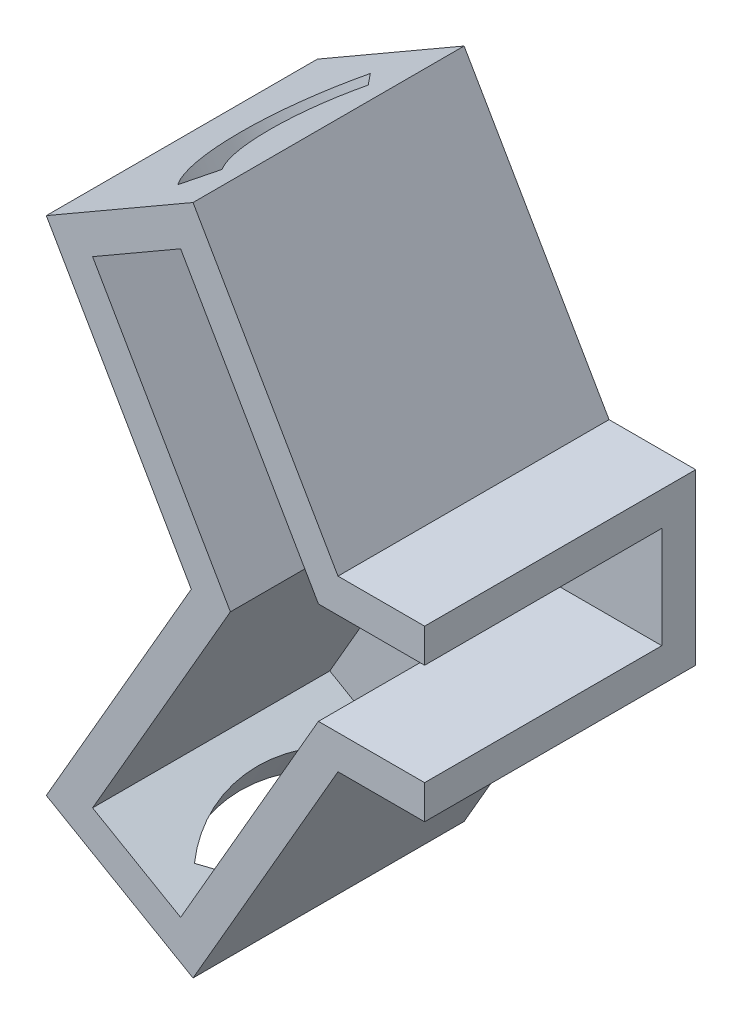
ISO-10303-21;
HEADER;
FILE_DESCRIPTION(('STEP AP214'),'2;1');
FILE_NAME('part.step','',(''),(''),'','','');
FILE_SCHEMA(('AUTOMOTIVE_DESIGN { 1 0 10303 214 1 1 1 1 }'));
ENDSEC;
DATA;
#1=APPLICATION_CONTEXT('core data for automotive mechanical design processes');
#2=APPLICATION_PROTOCOL_DEFINITION('international standard','automotive_design',2000,#1);
#3=PRODUCT_CONTEXT('',#1,'mechanical');
#4=PRODUCT('Part','Part','',(#3));
#5=PRODUCT_RELATED_PRODUCT_CATEGORY('part','',(#4));
#6=PRODUCT_DEFINITION_FORMATION('','',#4);
#7=PRODUCT_DEFINITION_CONTEXT('part definition',#1,'design');
#8=PRODUCT_DEFINITION('design','',#6,#7);
#9=PRODUCT_DEFINITION_SHAPE('','',#8);
#10=(LENGTH_UNIT() NAMED_UNIT(*) SI_UNIT(.MILLI.,.METRE.));
#11=(NAMED_UNIT(*) PLANE_ANGLE_UNIT() SI_UNIT($,.RADIAN.));
#12=(NAMED_UNIT(*) SI_UNIT($,.STERADIAN.) SOLID_ANGLE_UNIT());
#13=UNCERTAINTY_MEASURE_WITH_UNIT(LENGTH_MEASURE(1.E-05),#10,'distance_accuracy_value','');
#14=(GEOMETRIC_REPRESENTATION_CONTEXT(3) GLOBAL_UNCERTAINTY_ASSIGNED_CONTEXT((#13)) GLOBAL_UNIT_ASSIGNED_CONTEXT((#10,
#11,#12)) REPRESENTATION_CONTEXT('',''));
#15=CARTESIAN_POINT('',(0.,0.,0.));
#16=DIRECTION('',(0.,0.,1.));
#17=DIRECTION('',(1.,0.,0.));
#18=AXIS2_PLACEMENT_3D('',#15,#16,#17);
#19=CARTESIAN_POINT('',(-11.1650635094611,-7.41025403784441,8.));
#20=DIRECTION('',(0.499999999999998,0.86602540378444,0.));
#21=DIRECTION('',(-0.86602540378444,0.499999999999998,0.));
#22=AXIS2_PLACEMENT_3D('',#19,#20,#21);
#23=PLANE('',#22);
#24=DIRECTION('',(0.86602540378444,-0.499999999999998,0.));
#25=VECTOR('',#24,1.);
#26=CARTESIAN_POINT('',(-11.1650635094611,-7.41025403784441,0.));
#27=LINE('',#26,#25);
#28=CARTESIAN_POINT('',(-11.1650635094611,-7.41025403784441,0.));
#29=VERTEX_POINT('',#28);
#30=CARTESIAN_POINT('',(-6.83493649053888,-9.91025403784439,0.));
#31=VERTEX_POINT('',#30);
#32=EDGE_CURVE('E333',#29,#31,#27,.T.);
#33=ORIENTED_EDGE('',*,*,#32,.T.);
#34=DIRECTION('',(0.,0.,-1.));
#35=VECTOR('',#34,1.);
#36=CARTESIAN_POINT('',(-6.83493649053888,-9.91025403784439,8.));
#37=LINE('',#36,#35);
#38=CARTESIAN_POINT('',(-6.83493649053888,-9.91025403784439,8.));
#39=VERTEX_POINT('',#38);
#40=EDGE_CURVE('E337',#39,#31,#37,.T.);
#41=ORIENTED_EDGE('',*,*,#40,.F.);
#42=DIRECTION('',(0.86602540378444,-0.499999999999998,0.));
#43=VECTOR('',#42,1.);
#44=CARTESIAN_POINT('',(-11.1650635094611,-7.41025403784441,8.));
#45=LINE('',#44,#43);
#46=CARTESIAN_POINT('',(-11.1650635094611,-7.41025403784441,8.));
#47=VERTEX_POINT('',#46);
#48=EDGE_CURVE('E335',#47,#39,#45,.T.);
#49=ORIENTED_EDGE('',*,*,#48,.F.);
#50=DIRECTION('',(0.,0.,-1.));
#51=VECTOR('',#50,1.);
#52=CARTESIAN_POINT('',(-11.1650635094611,-7.41025403784441,8.));
#53=LINE('',#52,#51);
#54=EDGE_CURVE('E345',#47,#29,#53,.T.);
#55=ORIENTED_EDGE('',*,*,#54,.T.);
#56=EDGE_LOOP('',(#33,#41,#49,#55));
#57=FACE_BOUND('',#56,.T.);
#58=CARTESIAN_POINT('',(-5.86065791128139,-10.4727540378444,4.));
#59=DIRECTION('',(0.499999999999998,0.86602540378444,0.));
#60=DIRECTION('',(-0.86602540378444,0.499999999999998,0.));
#61=AXIS2_PLACEMENT_3D('',#58,#59,#60);
#62=CIRCLE('',#61,3.125);
#63=CARTESIAN_POINT('',(-7.82041367415566,-9.34128852060302,6.1551724137931));
#64=VERTEX_POINT('',#63);
#65=CARTESIAN_POINT('',(-7.82041367415566,-9.34128852060303,1.8448275862069));
#66=VERTEX_POINT('',#65);
#67=EDGE_CURVE('E56',#64,#66,#62,.F.);
#68=ORIENTED_EDGE('',*,*,#67,.T.);
#69=DIRECTION('',(0.627121844119767,-0.36206896551724,0.689655172413792));
#70=VECTOR('',#69,1.);
#71=CARTESIAN_POINT('',(-8.44753551827543,-8.97921955508579,1.1551724137931));
#72=LINE('',#71,#70);
#73=CARTESIAN_POINT('',(-8.44753551827543,-8.97921955508579,1.1551724137931));
#74=VERTEX_POINT('',#73);
#75=EDGE_CURVE('E231',#74,#66,#72,.T.);
#76=ORIENTED_EDGE('',*,*,#75,.F.);
#77=CARTESIAN_POINT('',(-5.86065791128139,-10.4727540378444,4.));
#78=DIRECTION('',(0.499999999999998,0.86602540378444,0.));
#79=DIRECTION('',(-0.86602540378444,0.499999999999998,0.));
#80=AXIS2_PLACEMENT_3D('',#77,#78,#79);
#81=CIRCLE('',#80,4.125);
#82=CARTESIAN_POINT('',(-8.44753551827543,-8.97921955508579,6.8448275862069));
#83=VERTEX_POINT('',#82);
#84=EDGE_CURVE('E217',#83,#74,#81,.F.);
#85=ORIENTED_EDGE('',*,*,#84,.F.);
#86=DIRECTION('',(-0.627121844119766,0.36206896551724,0.689655172413793));
#87=VECTOR('',#86,1.);
#88=CARTESIAN_POINT('',(-7.82041367415566,-9.34128852060303,6.1551724137931));
#89=LINE('',#88,#87);
#90=EDGE_CURVE('E226',#64,#83,#89,.T.);
#91=ORIENTED_EDGE('',*,*,#90,.F.);
#92=EDGE_LOOP('',(#68,#76,#85,#91));
#93=FACE_BOUND('',#92,.T.);
#94=ADVANCED_FACE('F41',(#57,#93),#23,.F.);
#95=CARTESIAN_POINT('',(-10.6650635094611,-6.54422863405996,8.));
#96=DIRECTION('',(0.499999999999998,0.86602540378444,0.));
#97=DIRECTION('',(-0.86602540378444,0.499999999999998,0.));
#98=AXIS2_PLACEMENT_3D('',#95,#96,#97);
#99=PLANE('',#98);
#100=DIRECTION('',(0.86602540378444,-0.499999999999998,0.));
#101=VECTOR('',#100,1.);
#102=CARTESIAN_POINT('',(-5.49999999999998,-9.52627944162883,1.));
#103=LINE('',#102,#101);
#104=CARTESIAN_POINT('',(-9.79903810567664,-7.04422863405996,1.));
#105=VERTEX_POINT('',#104);
#106=CARTESIAN_POINT('',(-7.20096189432332,-8.54422863405996,1.));
#107=VERTEX_POINT('',#106);
#108=EDGE_CURVE('E291',#105,#107,#103,.T.);
#109=ORIENTED_EDGE('',*,*,#108,.F.);
#110=DIRECTION('',(0.,0.,-1.));
#111=VECTOR('',#110,1.);
#112=CARTESIAN_POINT('',(-9.79903810567664,-7.04422863405996,8.));
#113=LINE('',#112,#111);
#114=CARTESIAN_POINT('',(-9.79903810567664,-7.04422863405996,8.));
#115=VERTEX_POINT('',#114);
#116=EDGE_CURVE('E301',#115,#105,#113,.T.);
#117=ORIENTED_EDGE('',*,*,#116,.F.);
#118=DIRECTION('',(0.86602540378444,-0.499999999999998,0.));
#119=VECTOR('',#118,1.);
#120=CARTESIAN_POINT('',(-5.49999999999998,-9.52627944162883,8.));
#121=LINE('',#120,#119);
#122=CARTESIAN_POINT('',(-7.20096189432332,-8.54422863405996,8.));
#123=VERTEX_POINT('',#122);
#124=EDGE_CURVE('E304',#115,#123,#121,.T.);
#125=ORIENTED_EDGE('',*,*,#124,.T.);
#126=DIRECTION('',(0.,0.,-1.));
#127=VECTOR('',#126,1.);
#128=CARTESIAN_POINT('',(-7.20096189432332,-8.54422863405996,8.));
#129=LINE('',#128,#127);
#130=EDGE_CURVE('E302',#123,#107,#129,.T.);
#131=ORIENTED_EDGE('',*,*,#130,.T.);
#132=EDGE_LOOP('',(#109,#117,#125,#131));
#133=FACE_BOUND('',#132,.T.);
#134=DIRECTION('',(-0.627121844119767,0.36206896551724,-0.689655172413793));
#135=VECTOR('',#134,1.);
#136=CARTESIAN_POINT('',(-6.41216824474083,-8.99963885998148,2.8436385255648));
#137=LINE('',#136,#135);
#138=CARTESIAN_POINT('',(-7.32041367415566,-8.47526311681858,1.8448275862069));
#139=VERTEX_POINT('',#138);
#140=CARTESIAN_POINT('',(-7.94753551827543,-8.11319415130134,1.1551724137931));
#141=VERTEX_POINT('',#140);
#142=EDGE_CURVE('E49',#139,#141,#137,.T.);
#143=ORIENTED_EDGE('',*,*,#142,.F.);
#144=CARTESIAN_POINT('',(-5.36065791128139,-9.60672863405995,4.));
#145=DIRECTION('',(0.499999999999998,0.86602540378444,0.));
#146=DIRECTION('',(-0.86602540378444,0.499999999999998,0.));
#147=AXIS2_PLACEMENT_3D('',#144,#145,#146);
#148=CIRCLE('',#147,3.125);
#149=CARTESIAN_POINT('',(-7.32041367415566,-8.47526311681858,6.1551724137931));
#150=VERTEX_POINT('',#149);
#151=EDGE_CURVE('E11',#139,#150,#148,.T.);
#152=ORIENTED_EDGE('',*,*,#151,.T.);
#153=DIRECTION('',(0.627121844119766,-0.36206896551724,-0.689655172413793));
#154=VECTOR('',#153,1.);
#155=CARTESIAN_POINT('',(-9.87215083298781,-7.00201698126567,8.96135552913199));
#156=LINE('',#155,#154);
#157=CARTESIAN_POINT('',(-7.94753551827543,-8.11319415130134,6.8448275862069));
#158=VERTEX_POINT('',#157);
#159=EDGE_CURVE('E408',#158,#150,#156,.T.);
#160=ORIENTED_EDGE('',*,*,#159,.F.);
#161=CARTESIAN_POINT('',(-5.36065791128139,-9.60672863405995,4.));
#162=DIRECTION('',(0.499999999999998,0.86602540378444,0.));
#163=DIRECTION('',(-0.86602540378444,0.499999999999998,0.));
#164=AXIS2_PLACEMENT_3D('',#161,#162,#163);
#165=CIRCLE('',#164,4.125);
#166=EDGE_CURVE('E220',#141,#158,#165,.T.);
#167=ORIENTED_EDGE('',*,*,#166,.F.);
#168=EDGE_LOOP('',(#143,#152,#160,#167));
#169=FACE_BOUND('',#168,.T.);
#170=ADVANCED_FACE('F415',(#133,#169),#99,.T.);
#171=CARTESIAN_POINT('',(0.,2.5,8.));
#172=DIRECTION('',(1.,0.,0.));
#173=DIRECTION('',(0.,0.,-1.));
#174=AXIS2_PLACEMENT_3D('',#171,#172,#173);
#175=PLANE('',#174);
#176=DIRECTION('',(0.,-1.,0.));
#177=VECTOR('',#176,1.);
#178=CARTESIAN_POINT('',(0.,2.5,8.));
#179=LINE('',#178,#177);
#180=CARTESIAN_POINT('',(0.,2.5,8.));
#181=VERTEX_POINT('',#180);
#182=CARTESIAN_POINT('',(0.,1.5,8.));
#183=VERTEX_POINT('',#182);
#184=EDGE_CURVE('E367',#181,#183,#179,.T.);
#185=ORIENTED_EDGE('',*,*,#184,.T.);
#186=DIRECTION('',(0.,0.,-1.));
#187=VECTOR('',#186,1.);
#188=CARTESIAN_POINT('',(0.,1.5,8.));
#189=LINE('',#188,#187);
#190=CARTESIAN_POINT('',(0.,1.5,1.));
#191=VERTEX_POINT('',#190);
#192=EDGE_CURVE('E283',#183,#191,#189,.T.);
#193=ORIENTED_EDGE('',*,*,#192,.T.);
#194=DIRECTION('',(0.,-1.,0.));
#195=VECTOR('',#194,1.);
#196=CARTESIAN_POINT('',(0.,0.,1.));
#197=LINE('',#196,#195);
#198=CARTESIAN_POINT('',(0.,-1.5,1.));
#199=VERTEX_POINT('',#198);
#200=EDGE_CURVE('E288',#191,#199,#197,.T.);
#201=ORIENTED_EDGE('',*,*,#200,.T.);
#202=DIRECTION('',(0.,0.,-1.));
#203=VECTOR('',#202,1.);
#204=CARTESIAN_POINT('',(0.,-1.5,8.));
#205=LINE('',#204,#203);
#206=CARTESIAN_POINT('',(0.,-1.5,8.));
#207=VERTEX_POINT('',#206);
#208=EDGE_CURVE('E273',#207,#199,#205,.T.);
#209=ORIENTED_EDGE('',*,*,#208,.F.);
#210=CARTESIAN_POINT('',(0.,-2.5,8.));
#211=VERTEX_POINT('',#210);
#212=EDGE_CURVE('E366',#207,#211,#179,.T.);
#213=ORIENTED_EDGE('',*,*,#212,.T.);
#214=DIRECTION('',(0.,0.,-1.));
#215=VECTOR('',#214,1.);
#216=CARTESIAN_POINT('',(0.,-2.5,8.));
#217=LINE('',#216,#215);
#218=CARTESIAN_POINT('',(0.,-2.5,0.));
#219=VERTEX_POINT('',#218);
#220=EDGE_CURVE('E391',#211,#219,#217,.T.);
#221=ORIENTED_EDGE('',*,*,#220,.T.);
#222=DIRECTION('',(0.,-1.,0.));
#223=VECTOR('',#222,1.);
#224=CARTESIAN_POINT('',(0.,2.5,0.));
#225=LINE('',#224,#223);
#226=CARTESIAN_POINT('',(0.,2.5,0.));
#227=VERTEX_POINT('',#226);
#228=EDGE_CURVE('E383',#227,#219,#225,.T.);
#229=ORIENTED_EDGE('',*,*,#228,.F.);
#230=DIRECTION('',(0.,0.,-1.));
#231=VECTOR('',#230,1.);
#232=CARTESIAN_POINT('',(0.,2.5,8.));
#233=LINE('',#232,#231);
#234=EDGE_CURVE('E389',#181,#227,#233,.T.);
#235=ORIENTED_EDGE('',*,*,#234,.F.);
#236=EDGE_LOOP('',(#185,#193,#201,#209,#213,#221,#229,#235));
#237=FACE_BOUND('',#236,.T.);
#238=ADVANCED_FACE('F436',(#237),#175,.T.);
#239=CARTESIAN_POINT('',(-6.1650635094611,-1.25,8.));
#240=DIRECTION('',(-0.86602540378444,-0.499999999999998,0.));
#241=DIRECTION('',(0.499999999999998,-0.86602540378444,0.));
#242=AXIS2_PLACEMENT_3D('',#239,#240,#241);
#243=PLANE('',#242);
#244=DIRECTION('',(-0.499999999999998,0.86602540378444,0.));
#245=VECTOR('',#244,1.);
#246=CARTESIAN_POINT('',(-6.1650635094611,-1.25,0.));
#247=LINE('',#246,#245);
#248=CARTESIAN_POINT('',(-6.88675134594813,0.,0.));
#249=VERTEX_POINT('',#248);
#250=CARTESIAN_POINT('',(-11.1650635094611,7.41025403784441,0.));
#251=VERTEX_POINT('',#250);
#252=EDGE_CURVE('E378',#249,#251,#247,.T.);
#253=ORIENTED_EDGE('',*,*,#252,.F.);
#254=DIRECTION('',(0.,0.,1.));
#255=VECTOR('',#254,1.);
#256=CARTESIAN_POINT('',(-6.88675134594813,0.,8.));
#257=LINE('',#256,#255);
#258=CARTESIAN_POINT('',(-6.88675134594813,0.,8.));
#259=VERTEX_POINT('',#258);
#260=EDGE_CURVE('E351',#249,#259,#257,.T.);
#261=ORIENTED_EDGE('',*,*,#260,.T.);
#262=DIRECTION('',(-0.499999999999998,0.86602540378444,0.));
#263=VECTOR('',#262,1.);
#264=CARTESIAN_POINT('',(-6.1650635094611,-1.25,8.));
#265=LINE('',#264,#263);
#266=CARTESIAN_POINT('',(-11.1650635094611,7.41025403784441,8.));
#267=VERTEX_POINT('',#266);
#268=EDGE_CURVE('E361',#259,#267,#265,.T.);
#269=ORIENTED_EDGE('',*,*,#268,.T.);
#270=DIRECTION('',(0.,0.,-1.));
#271=VECTOR('',#270,1.);
#272=CARTESIAN_POINT('',(-11.1650635094611,7.41025403784441,8.));
#273=LINE('',#272,#271);
#274=EDGE_CURVE('E393',#267,#251,#273,.T.);
#275=ORIENTED_EDGE('',*,*,#274,.T.);
#276=EDGE_LOOP('',(#253,#261,#269,#275));
#277=FACE_BOUND('',#276,.T.);
#278=ADVANCED_FACE('F465',(#277),#243,.T.);
#279=CARTESIAN_POINT('',(-1.8349364905389,1.25,8.));
#280=DIRECTION('',(-0.86602540378444,-0.499999999999998,0.));
#281=DIRECTION('',(0.499999999999998,-0.86602540378444,0.));
#282=AXIS2_PLACEMENT_3D('',#279,#280,#281);
#283=PLANE('',#282);
#284=DIRECTION('',(-0.499999999999998,0.86602540378444,0.));
#285=VECTOR('',#284,1.);
#286=CARTESIAN_POINT('',(-1.8349364905389,1.25,0.));
#287=LINE('',#286,#285);
#288=CARTESIAN_POINT('',(-2.55662432702593,2.5,0.));
#289=VERTEX_POINT('',#288);
#290=CARTESIAN_POINT('',(-6.83493649053888,9.91025403784439,0.));
#291=VERTEX_POINT('',#290);
#292=EDGE_CURVE('E354',#289,#291,#287,.T.);
#293=ORIENTED_EDGE('',*,*,#292,.T.);
#294=DIRECTION('',(0.,0.,-1.));
#295=VECTOR('',#294,1.);
#296=CARTESIAN_POINT('',(-6.83493649053888,9.91025403784439,8.));
#297=LINE('',#296,#295);
#298=CARTESIAN_POINT('',(-6.83493649053888,9.91025403784439,8.));
#299=VERTEX_POINT('',#298);
#300=EDGE_CURVE('E396',#299,#291,#297,.T.);
#301=ORIENTED_EDGE('',*,*,#300,.F.);
#302=DIRECTION('',(-0.499999999999998,0.86602540378444,0.));
#303=VECTOR('',#302,1.);
#304=CARTESIAN_POINT('',(-1.8349364905389,1.25,8.));
#305=LINE('',#304,#303);
#306=CARTESIAN_POINT('',(-2.55662432702593,2.5,8.));
#307=VERTEX_POINT('',#306);
#308=EDGE_CURVE('E355',#307,#299,#305,.T.);
#309=ORIENTED_EDGE('',*,*,#308,.F.);
#310=DIRECTION('',(0.,0.,-1.));
#311=VECTOR('',#310,1.);
#312=CARTESIAN_POINT('',(-2.55662432702593,2.5,8.));
#313=LINE('',#312,#311);
#314=EDGE_CURVE('E372',#307,#289,#313,.T.);
#315=ORIENTED_EDGE('',*,*,#314,.T.);
#316=EDGE_LOOP('',(#293,#301,#309,#315));
#317=FACE_BOUND('',#316,.T.);
#318=ADVANCED_FACE('F43',(#317),#283,.F.);
#319=CARTESIAN_POINT('',(-11.1650635094611,7.41025403784441,8.));
#320=DIRECTION('',(-0.499999999999998,0.86602540378444,0.));
#321=DIRECTION('',(-0.86602540378444,-0.499999999999998,0.));
#322=AXIS2_PLACEMENT_3D('',#319,#320,#321);
#323=PLANE('',#322);
#324=CARTESIAN_POINT('',(-5.86065791128139,10.4727540378444,4.));
#325=DIRECTION('',(-0.499999999999998,0.86602540378444,0.));
#326=DIRECTION('',(-0.86602540378444,-0.499999999999998,0.));
#327=AXIS2_PLACEMENT_3D('',#324,#325,#326);
#328=CIRCLE('',#327,3.125);
#329=CARTESIAN_POINT('',(-7.82041367415566,9.34128852060303,6.1551724137931));
#330=VERTEX_POINT('',#329);
#331=CARTESIAN_POINT('',(-7.82041367415566,9.34128852060302,1.8448275862069));
#332=VERTEX_POINT('',#331);
#333=EDGE_CURVE('E238',#330,#332,#328,.F.);
#334=ORIENTED_EDGE('',*,*,#333,.F.);
#335=DIRECTION('',(-0.627121844119766,-0.36206896551724,0.689655172413793));
#336=VECTOR('',#335,1.);
#337=CARTESIAN_POINT('',(-7.82041367415566,9.34128852060303,6.1551724137931));
#338=LINE('',#337,#336);
#339=CARTESIAN_POINT('',(-8.44753551827543,8.97921955508579,6.8448275862069));
#340=VERTEX_POINT('',#339);
#341=EDGE_CURVE('E248',#330,#340,#338,.T.);
#342=ORIENTED_EDGE('',*,*,#341,.T.);
#343=CARTESIAN_POINT('',(-5.86065791128139,10.4727540378444,4.));
#344=DIRECTION('',(-0.499999999999998,0.86602540378444,0.));
#345=DIRECTION('',(-0.86602540378444,-0.499999999999998,0.));
#346=AXIS2_PLACEMENT_3D('',#343,#344,#345);
#347=CIRCLE('',#346,4.125);
#348=CARTESIAN_POINT('',(-8.44753551827543,8.97921955508579,1.1551724137931));
#349=VERTEX_POINT('',#348);
#350=EDGE_CURVE('E245',#340,#349,#347,.F.);
#351=ORIENTED_EDGE('',*,*,#350,.T.);
#352=DIRECTION('',(0.627121844119767,0.36206896551724,0.689655172413792));
#353=VECTOR('',#352,1.);
#354=CARTESIAN_POINT('',(-8.44753551827543,8.97921955508579,1.1551724137931));
#355=LINE('',#354,#353);
#356=EDGE_CURVE('E242',#349,#332,#355,.T.);
#357=ORIENTED_EDGE('',*,*,#356,.T.);
#358=EDGE_LOOP('',(#334,#342,#351,#357));
#359=FACE_BOUND('',#358,.T.);
#360=DIRECTION('',(0.86602540378444,0.499999999999998,0.));
#361=VECTOR('',#360,1.);
#362=CARTESIAN_POINT('',(-11.1650635094611,7.41025403784441,0.));
#363=LINE('',#362,#361);
#364=EDGE_CURVE('E375',#251,#291,#363,.T.);
#365=ORIENTED_EDGE('',*,*,#364,.F.);
#366=ORIENTED_EDGE('',*,*,#274,.F.);
#367=DIRECTION('',(0.86602540378444,0.499999999999998,0.));
#368=VECTOR('',#367,1.);
#369=CARTESIAN_POINT('',(-11.1650635094611,7.41025403784441,8.));
#370=LINE('',#369,#368);
#371=EDGE_CURVE('E357',#267,#299,#370,.T.);
#372=ORIENTED_EDGE('',*,*,#371,.T.);
#373=ORIENTED_EDGE('',*,*,#300,.T.);
#374=EDGE_LOOP('',(#365,#366,#372,#373));
#375=FACE_BOUND('',#374,.T.);
#376=ADVANCED_FACE('F469',(#359,#375),#323,.T.);
#377=CARTESIAN_POINT('',(0.,-2.5,8.));
#378=DIRECTION('',(0.,-1.,0.));
#379=DIRECTION('',(0.,0.,-1.));
#380=AXIS2_PLACEMENT_3D('',#377,#378,#379);
#381=PLANE('',#380);
#382=DIRECTION('',(0.,0.,-1.));
#383=VECTOR('',#382,1.);
#384=CARTESIAN_POINT('',(-2.55662432702593,-2.5,8.));
#385=LINE('',#384,#383);
#386=CARTESIAN_POINT('',(-2.55662432702593,-2.5,8.));
#387=VERTEX_POINT('',#386);
#388=CARTESIAN_POINT('',(-2.55662432702593,-2.5,0.));
#389=VERTEX_POINT('',#388);
#390=EDGE_CURVE('E348',#387,#389,#385,.T.);
#391=ORIENTED_EDGE('',*,*,#390,.T.);
#392=DIRECTION('',(-1.,0.,0.));
#393=VECTOR('',#392,1.);
#394=CARTESIAN_POINT('',(0.,-2.5,0.));
#395=LINE('',#394,#393);
#396=EDGE_CURVE('E380',#219,#389,#395,.T.);
#397=ORIENTED_EDGE('',*,*,#396,.F.);
#398=ORIENTED_EDGE('',*,*,#220,.F.);
#399=DIRECTION('',(-1.,0.,0.));
#400=VECTOR('',#399,1.);
#401=CARTESIAN_POINT('',(0.,-2.5,8.));
#402=LINE('',#401,#400);
#403=EDGE_CURVE('E363',#211,#387,#402,.T.);
#404=ORIENTED_EDGE('',*,*,#403,.T.);
#405=EDGE_LOOP('',(#391,#397,#398,#404));
#406=FACE_BOUND('',#405,.T.);
#407=ADVANCED_FACE('F461',(#406),#381,.T.);
#408=CARTESIAN_POINT('',(0.,2.5,8.));
#409=DIRECTION('',(0.,-1.,0.));
#410=DIRECTION('',(0.,0.,-1.));
#411=AXIS2_PLACEMENT_3D('',#408,#409,#410);
#412=PLANE('',#411);
#413=DIRECTION('',(-1.,0.,0.));
#414=VECTOR('',#413,1.);
#415=CARTESIAN_POINT('',(0.,2.5,0.));
#416=LINE('',#415,#414);
#417=EDGE_CURVE('E358',#227,#289,#416,.T.);
#418=ORIENTED_EDGE('',*,*,#417,.T.);
#419=ORIENTED_EDGE('',*,*,#314,.F.);
#420=DIRECTION('',(-1.,0.,0.));
#421=VECTOR('',#420,1.);
#422=CARTESIAN_POINT('',(0.,2.5,8.));
#423=LINE('',#422,#421);
#424=EDGE_CURVE('E370',#181,#307,#423,.T.);
#425=ORIENTED_EDGE('',*,*,#424,.F.);
#426=ORIENTED_EDGE('',*,*,#234,.T.);
#427=EDGE_LOOP('',(#418,#419,#425,#426));
#428=FACE_BOUND('',#427,.T.);
#429=ADVANCED_FACE('F454',(#428),#412,.F.);
#430=CARTESIAN_POINT('',(0.,0.,8.));
#431=DIRECTION('',(0.,0.,-1.));
#432=DIRECTION('',(0.,-1.,0.));
#433=AXIS2_PLACEMENT_3D('',#430,#431,#432);
#434=PLANE('',#433);
#435=ORIENTED_EDGE('',*,*,#212,.F.);
#436=DIRECTION('',(-1.,0.,0.));
#437=VECTOR('',#436,1.);
#438=CARTESIAN_POINT('',(0.,-1.5,8.));
#439=LINE('',#438,#437);
#440=CARTESIAN_POINT('',(-3.13397459621556,-1.5,8.));
#441=VERTEX_POINT('',#440);
#442=EDGE_CURVE('E310',#207,#441,#439,.T.);
#443=ORIENTED_EDGE('',*,*,#442,.T.);
#444=DIRECTION('',(-0.499999999999998,-0.86602540378444,0.));
#445=VECTOR('',#444,1.);
#446=CARTESIAN_POINT('',(-1.70096189432335,0.982050807568876,8.));
#447=LINE('',#446,#445);
#448=EDGE_CURVE('E298',#441,#123,#447,.T.);
#449=ORIENTED_EDGE('',*,*,#448,.T.);
#450=ORIENTED_EDGE('',*,*,#124,.F.);
#451=DIRECTION('',(-0.499999999999998,-0.86602540378444,0.));
#452=VECTOR('',#451,1.);
#453=CARTESIAN_POINT('',(-4.29903810567667,2.48205080756887,8.));
#454=LINE('',#453,#452);
#455=CARTESIAN_POINT('',(-5.73205080756887,0.,8.));
#456=VERTEX_POINT('',#455);
#457=EDGE_CURVE('E312',#456,#115,#454,.T.);
#458=ORIENTED_EDGE('',*,*,#457,.F.);
#459=DIRECTION('',(-0.499999999999998,0.86602540378444,0.));
#460=VECTOR('',#459,1.);
#461=CARTESIAN_POINT('',(-4.29903810567667,-2.48205080756887,8.));
#462=LINE('',#461,#460);
#463=CARTESIAN_POINT('',(-9.79903810567664,7.04422863405996,8.));
#464=VERTEX_POINT('',#463);
#465=EDGE_CURVE('E307',#456,#464,#462,.T.);
#466=ORIENTED_EDGE('',*,*,#465,.T.);
#467=DIRECTION('',(0.86602540378444,0.499999999999998,0.));
#468=VECTOR('',#467,1.);
#469=CARTESIAN_POINT('',(-5.49999999999998,9.52627944162883,8.));
#470=LINE('',#469,#468);
#471=CARTESIAN_POINT('',(-7.20096189432332,8.54422863405996,8.));
#472=VERTEX_POINT('',#471);
#473=EDGE_CURVE('E311',#464,#472,#470,.T.);
#474=ORIENTED_EDGE('',*,*,#473,.T.);
#475=DIRECTION('',(-0.499999999999998,0.86602540378444,0.));
#476=VECTOR('',#475,1.);
#477=CARTESIAN_POINT('',(-1.70096189432335,-0.982050807568876,8.));
#478=LINE('',#477,#476);
#479=CARTESIAN_POINT('',(-3.13397459621556,1.5,8.));
#480=VERTEX_POINT('',#479);
#481=EDGE_CURVE('E287',#480,#472,#478,.T.);
#482=ORIENTED_EDGE('',*,*,#481,.F.);
#483=DIRECTION('',(-1.,0.,0.));
#484=VECTOR('',#483,1.);
#485=CARTESIAN_POINT('',(0.,1.5,8.));
#486=LINE('',#485,#484);
#487=EDGE_CURVE('E284',#183,#480,#486,.T.);
#488=ORIENTED_EDGE('',*,*,#487,.F.);
#489=ORIENTED_EDGE('',*,*,#184,.F.);
#490=ORIENTED_EDGE('',*,*,#424,.T.);
#491=ORIENTED_EDGE('',*,*,#308,.T.);
#492=ORIENTED_EDGE('',*,*,#371,.F.);
#493=ORIENTED_EDGE('',*,*,#268,.F.);
#494=DIRECTION('',(-0.499999999999998,-0.86602540378444,0.));
#495=VECTOR('',#494,1.);
#496=CARTESIAN_POINT('',(-6.1650635094611,1.25,8.));
#497=LINE('',#496,#495);
#498=EDGE_CURVE('E332',#259,#47,#497,.T.);
#499=ORIENTED_EDGE('',*,*,#498,.T.);
#500=ORIENTED_EDGE('',*,*,#48,.T.);
#501=DIRECTION('',(-0.499999999999998,-0.86602540378444,0.));
#502=VECTOR('',#501,1.);
#503=CARTESIAN_POINT('',(-1.8349364905389,-1.25,8.));
#504=LINE('',#503,#502);
#505=EDGE_CURVE('E329',#387,#39,#504,.T.);
#506=ORIENTED_EDGE('',*,*,#505,.F.);
#507=ORIENTED_EDGE('',*,*,#403,.F.);
#508=EDGE_LOOP('',(#435,#443,#449,#450,#458,#466,#474,#482,#488,#489,#490,#491,#492,#493,#499,
#500,#506,#507));
#509=FACE_BOUND('',#508,.T.);
#510=ADVANCED_FACE('F451',(#509),#434,.F.);
#511=CARTESIAN_POINT('',(0.,0.,0.));
#512=DIRECTION('',(0.,0.,-1.));
#513=DIRECTION('',(0.,-1.,0.));
#514=AXIS2_PLACEMENT_3D('',#511,#512,#513);
#515=PLANE('',#514);
#516=DIRECTION('',(-0.499999999999998,-0.86602540378444,0.));
#517=VECTOR('',#516,1.);
#518=CARTESIAN_POINT('',(-6.1650635094611,1.25,0.));
#519=LINE('',#518,#517);
#520=EDGE_CURVE('E340',#249,#29,#519,.T.);
#521=ORIENTED_EDGE('',*,*,#520,.F.);
#522=ORIENTED_EDGE('',*,*,#252,.T.);
#523=ORIENTED_EDGE('',*,*,#364,.T.);
#524=ORIENTED_EDGE('',*,*,#292,.F.);
#525=ORIENTED_EDGE('',*,*,#417,.F.);
#526=ORIENTED_EDGE('',*,*,#228,.T.);
#527=ORIENTED_EDGE('',*,*,#396,.T.);
#528=DIRECTION('',(-0.499999999999998,-0.86602540378444,0.));
#529=VECTOR('',#528,1.);
#530=CARTESIAN_POINT('',(-1.8349364905389,-1.25,0.));
#531=LINE('',#530,#529);
#532=EDGE_CURVE('E277',#389,#31,#531,.T.);
#533=ORIENTED_EDGE('',*,*,#532,.T.);
#534=ORIENTED_EDGE('',*,*,#32,.F.);
#535=EDGE_LOOP('',(#521,#522,#523,#524,#525,#526,#527,#533,#534));
#536=FACE_BOUND('',#535,.T.);
#537=ADVANCED_FACE('F449',(#536),#515,.T.);
#538=CARTESIAN_POINT('',(-1.8349364905389,-1.25,8.));
#539=DIRECTION('',(0.86602540378444,-0.499999999999998,0.));
#540=DIRECTION('',(0.499999999999998,0.86602540378444,0.));
#541=AXIS2_PLACEMENT_3D('',#538,#539,#540);
#542=PLANE('',#541);
#543=ORIENTED_EDGE('',*,*,#532,.F.);
#544=ORIENTED_EDGE('',*,*,#390,.F.);
#545=ORIENTED_EDGE('',*,*,#505,.T.);
#546=ORIENTED_EDGE('',*,*,#40,.T.);
#547=EDGE_LOOP('',(#543,#544,#545,#546));
#548=FACE_BOUND('',#547,.T.);
#549=ADVANCED_FACE('F445',(#548),#542,.T.);
#550=CARTESIAN_POINT('',(-6.1650635094611,1.25,8.));
#551=DIRECTION('',(0.86602540378444,-0.499999999999998,0.));
#552=DIRECTION('',(0.499999999999998,0.86602540378444,0.));
#553=AXIS2_PLACEMENT_3D('',#550,#551,#552);
#554=PLANE('',#553);
#555=ORIENTED_EDGE('',*,*,#260,.F.);
#556=ORIENTED_EDGE('',*,*,#520,.T.);
#557=ORIENTED_EDGE('',*,*,#54,.F.);
#558=ORIENTED_EDGE('',*,*,#498,.F.);
#559=EDGE_LOOP('',(#555,#556,#557,#558));
#560=FACE_BOUND('',#559,.T.);
#561=ADVANCED_FACE('F441',(#560),#554,.F.);
#562=CARTESIAN_POINT('',(-5.29903810567666,-0.749999999999997,8.));
#563=DIRECTION('',(-0.86602540378444,-0.499999999999998,0.));
#564=DIRECTION('',(0.499999999999998,-0.86602540378444,0.));
#565=AXIS2_PLACEMENT_3D('',#562,#563,#564);
#566=PLANE('',#565);
#567=DIRECTION('',(-0.499999999999998,0.86602540378444,0.));
#568=VECTOR('',#567,1.);
#569=CARTESIAN_POINT('',(-4.29903810567667,-2.48205080756887,1.));
#570=LINE('',#569,#568);
#571=CARTESIAN_POINT('',(-5.73205080756887,0.,1.));
#572=VERTEX_POINT('',#571);
#573=CARTESIAN_POINT('',(-9.79903810567664,7.04422863405996,1.));
#574=VERTEX_POINT('',#573);
#575=EDGE_CURVE('E261',#572,#574,#570,.T.);
#576=ORIENTED_EDGE('',*,*,#575,.T.);
#577=DIRECTION('',(0.,0.,-1.));
#578=VECTOR('',#577,1.);
#579=CARTESIAN_POINT('',(-9.79903810567664,7.04422863405996,8.));
#580=LINE('',#579,#578);
#581=EDGE_CURVE('E269',#464,#574,#580,.T.);
#582=ORIENTED_EDGE('',*,*,#581,.F.);
#583=ORIENTED_EDGE('',*,*,#465,.F.);
#584=DIRECTION('',(0.,0.,1.));
#585=VECTOR('',#584,1.);
#586=CARTESIAN_POINT('',(-5.73205080756887,0.,8.));
#587=LINE('',#586,#585);
#588=EDGE_CURVE('E265',#572,#456,#587,.T.);
#589=ORIENTED_EDGE('',*,*,#588,.F.);
#590=EDGE_LOOP('',(#576,#582,#583,#589));
#591=FACE_BOUND('',#590,.T.);
#592=ADVANCED_FACE('F444',(#591),#566,.F.);
#593=CARTESIAN_POINT('',(-2.70096189432334,0.749999999999997,8.));
#594=DIRECTION('',(-0.86602540378444,-0.499999999999998,0.));
#595=DIRECTION('',(0.499999999999998,-0.86602540378444,0.));
#596=AXIS2_PLACEMENT_3D('',#593,#594,#595);
#597=PLANE('',#596);
#598=DIRECTION('',(-0.499999999999998,0.86602540378444,0.));
#599=VECTOR('',#598,1.);
#600=CARTESIAN_POINT('',(-1.70096189432335,-0.982050807568876,1.));
#601=LINE('',#600,#599);
#602=CARTESIAN_POINT('',(-3.13397459621556,1.5,1.));
#603=VERTEX_POINT('',#602);
#604=CARTESIAN_POINT('',(-7.20096189432332,8.54422863405996,1.));
#605=VERTEX_POINT('',#604);
#606=EDGE_CURVE('E267',#603,#605,#601,.T.);
#607=ORIENTED_EDGE('',*,*,#606,.F.);
#608=DIRECTION('',(0.,0.,-1.));
#609=VECTOR('',#608,1.);
#610=CARTESIAN_POINT('',(-3.13397459621556,1.5,8.));
#611=LINE('',#610,#609);
#612=EDGE_CURVE('E280',#480,#603,#611,.T.);
#613=ORIENTED_EDGE('',*,*,#612,.F.);
#614=ORIENTED_EDGE('',*,*,#481,.T.);
#615=DIRECTION('',(0.,0.,-1.));
#616=VECTOR('',#615,1.);
#617=CARTESIAN_POINT('',(-7.20096189432332,8.54422863405996,8.));
#618=LINE('',#617,#616);
#619=EDGE_CURVE('E272',#472,#605,#618,.T.);
#620=ORIENTED_EDGE('',*,*,#619,.T.);
#621=EDGE_LOOP('',(#607,#613,#614,#620));
#622=FACE_BOUND('',#621,.T.);
#623=ADVANCED_FACE('F535',(#622),#597,.T.);
#624=CARTESIAN_POINT('',(-10.6650635094611,6.54422863405996,8.));
#625=DIRECTION('',(-0.499999999999998,0.86602540378444,0.));
#626=DIRECTION('',(-0.86602540378444,-0.499999999999998,0.));
#627=AXIS2_PLACEMENT_3D('',#624,#625,#626);
#628=PLANE('',#627);
#629=DIRECTION('',(-0.627121844119766,-0.36206896551724,0.689655172413793));
#630=VECTOR('',#629,1.);
#631=CARTESIAN_POINT('',(-9.87215083298781,7.00201698126567,8.96135552913199));
#632=LINE('',#631,#630);
#633=CARTESIAN_POINT('',(-7.32041367415566,8.47526311681858,6.1551724137931));
#634=VERTEX_POINT('',#633);
#635=CARTESIAN_POINT('',(-7.94753551827543,8.11319415130134,6.8448275862069));
#636=VERTEX_POINT('',#635);
#637=EDGE_CURVE('E403',#634,#636,#632,.T.);
#638=ORIENTED_EDGE('',*,*,#637,.F.);
#639=CARTESIAN_POINT('',(-5.36065791128139,9.60672863405995,4.));
#640=DIRECTION('',(-0.499999999999998,0.86602540378444,0.));
#641=DIRECTION('',(-0.86602540378444,-0.499999999999998,0.));
#642=AXIS2_PLACEMENT_3D('',#639,#640,#641);
#643=CIRCLE('',#642,3.125);
#644=CARTESIAN_POINT('',(-7.32041367415566,8.47526311681858,1.8448275862069));
#645=VERTEX_POINT('',#644);
#646=EDGE_CURVE('E405',#634,#645,#643,.F.);
#647=ORIENTED_EDGE('',*,*,#646,.T.);
#648=DIRECTION('',(0.627121844119767,0.36206896551724,0.689655172413793));
#649=VECTOR('',#648,1.);
#650=CARTESIAN_POINT('',(-6.41216824474083,8.99963885998148,2.8436385255648));
#651=LINE('',#650,#649);
#652=CARTESIAN_POINT('',(-7.94753551827543,8.11319415130134,1.1551724137931));
#653=VERTEX_POINT('',#652);
#654=EDGE_CURVE('E398',#653,#645,#651,.T.);
#655=ORIENTED_EDGE('',*,*,#654,.F.);
#656=CARTESIAN_POINT('',(-5.36065791128139,9.60672863405995,4.));
#657=DIRECTION('',(-0.499999999999998,0.86602540378444,0.));
#658=DIRECTION('',(-0.86602540378444,-0.499999999999998,0.));
#659=AXIS2_PLACEMENT_3D('',#656,#657,#658);
#660=CIRCLE('',#659,4.125);
#661=EDGE_CURVE('E400',#636,#653,#660,.F.);
#662=ORIENTED_EDGE('',*,*,#661,.F.);
#663=EDGE_LOOP('',(#638,#647,#655,#662));
#664=FACE_BOUND('',#663,.T.);
#665=DIRECTION('',(0.86602540378444,0.499999999999998,0.));
#666=VECTOR('',#665,1.);
#667=CARTESIAN_POINT('',(-5.49999999999998,9.52627944162883,1.));
#668=LINE('',#667,#666);
#669=EDGE_CURVE('E264',#574,#605,#668,.T.);
#670=ORIENTED_EDGE('',*,*,#669,.T.);
#671=ORIENTED_EDGE('',*,*,#619,.F.);
#672=ORIENTED_EDGE('',*,*,#473,.F.);
#673=ORIENTED_EDGE('',*,*,#581,.T.);
#674=EDGE_LOOP('',(#670,#671,#672,#673));
#675=FACE_BOUND('',#674,.T.);
#676=ADVANCED_FACE('F529',(#664,#675),#628,.F.);
#677=CARTESIAN_POINT('',(0.,-1.5,8.));
#678=DIRECTION('',(0.,-1.,0.));
#679=DIRECTION('',(0.,0.,-1.));
#680=AXIS2_PLACEMENT_3D('',#677,#678,#679);
#681=PLANE('',#680);
#682=DIRECTION('',(0.,0.,-1.));
#683=VECTOR('',#682,1.);
#684=CARTESIAN_POINT('',(-3.13397459621556,-1.5,8.));
#685=LINE('',#684,#683);
#686=CARTESIAN_POINT('',(-3.13397459621556,-1.5,1.));
#687=VERTEX_POINT('',#686);
#688=EDGE_CURVE('E268',#441,#687,#685,.T.);
#689=ORIENTED_EDGE('',*,*,#688,.F.);
#690=ORIENTED_EDGE('',*,*,#442,.F.);
#691=ORIENTED_EDGE('',*,*,#208,.T.);
#692=DIRECTION('',(-1.,0.,0.));
#693=VECTOR('',#692,1.);
#694=CARTESIAN_POINT('',(0.,-1.5,1.));
#695=LINE('',#694,#693);
#696=EDGE_CURVE('E263',#199,#687,#695,.T.);
#697=ORIENTED_EDGE('',*,*,#696,.T.);
#698=EDGE_LOOP('',(#689,#690,#691,#697));
#699=FACE_BOUND('',#698,.T.);
#700=ADVANCED_FACE('F509',(#699),#681,.F.);
#701=CARTESIAN_POINT('',(0.,1.5,8.));
#702=DIRECTION('',(0.,-1.,0.));
#703=DIRECTION('',(0.,0.,-1.));
#704=AXIS2_PLACEMENT_3D('',#701,#702,#703);
#705=PLANE('',#704);
#706=DIRECTION('',(-1.,0.,0.));
#707=VECTOR('',#706,1.);
#708=CARTESIAN_POINT('',(0.,1.5,1.));
#709=LINE('',#708,#707);
#710=EDGE_CURVE('E285',#191,#603,#709,.T.);
#711=ORIENTED_EDGE('',*,*,#710,.F.);
#712=ORIENTED_EDGE('',*,*,#192,.F.);
#713=ORIENTED_EDGE('',*,*,#487,.T.);
#714=ORIENTED_EDGE('',*,*,#612,.T.);
#715=EDGE_LOOP('',(#711,#712,#713,#714));
#716=FACE_BOUND('',#715,.T.);
#717=ADVANCED_FACE('F537',(#716),#705,.T.);
#718=CARTESIAN_POINT('',(0.,0.,1.));
#719=DIRECTION('',(0.,0.,-1.));
#720=DIRECTION('',(0.,-1.,0.));
#721=AXIS2_PLACEMENT_3D('',#718,#719,#720);
#722=PLANE('',#721);
#723=DIRECTION('',(-0.499999999999998,-0.86602540378444,0.));
#724=VECTOR('',#723,1.);
#725=CARTESIAN_POINT('',(-4.29903810567667,2.48205080756887,1.));
#726=LINE('',#725,#724);
#727=EDGE_CURVE('E289',#572,#105,#726,.T.);
#728=ORIENTED_EDGE('',*,*,#727,.T.);
#729=ORIENTED_EDGE('',*,*,#108,.T.);
#730=DIRECTION('',(-0.499999999999998,-0.86602540378444,0.));
#731=VECTOR('',#730,1.);
#732=CARTESIAN_POINT('',(-1.70096189432335,0.982050807568876,1.));
#733=LINE('',#732,#731);
#734=EDGE_CURVE('E254',#687,#107,#733,.T.);
#735=ORIENTED_EDGE('',*,*,#734,.F.);
#736=ORIENTED_EDGE('',*,*,#696,.F.);
#737=ORIENTED_EDGE('',*,*,#200,.F.);
#738=ORIENTED_EDGE('',*,*,#710,.T.);
#739=ORIENTED_EDGE('',*,*,#606,.T.);
#740=ORIENTED_EDGE('',*,*,#669,.F.);
#741=ORIENTED_EDGE('',*,*,#575,.F.);
#742=EDGE_LOOP('',(#728,#729,#735,#736,#737,#738,#739,#740,#741));
#743=FACE_BOUND('',#742,.T.);
#744=ADVANCED_FACE('F513',(#743),#722,.F.);
#745=CARTESIAN_POINT('',(-2.70096189432334,-0.749999999999997,8.));
#746=DIRECTION('',(0.86602540378444,-0.499999999999998,0.));
#747=DIRECTION('',(0.499999999999998,0.86602540378444,0.));
#748=AXIS2_PLACEMENT_3D('',#745,#746,#747);
#749=PLANE('',#748);
#750=ORIENTED_EDGE('',*,*,#734,.T.);
#751=ORIENTED_EDGE('',*,*,#130,.F.);
#752=ORIENTED_EDGE('',*,*,#448,.F.);
#753=ORIENTED_EDGE('',*,*,#688,.T.);
#754=EDGE_LOOP('',(#750,#751,#752,#753));
#755=FACE_BOUND('',#754,.T.);
#756=ADVANCED_FACE('F517',(#755),#749,.F.);
#757=CARTESIAN_POINT('',(-5.29903810567666,0.749999999999997,8.));
#758=DIRECTION('',(0.86602540378444,-0.499999999999998,0.));
#759=DIRECTION('',(0.499999999999998,0.86602540378444,0.));
#760=AXIS2_PLACEMENT_3D('',#757,#758,#759);
#761=PLANE('',#760);
#762=ORIENTED_EDGE('',*,*,#588,.T.);
#763=ORIENTED_EDGE('',*,*,#457,.T.);
#764=ORIENTED_EDGE('',*,*,#116,.T.);
#765=ORIENTED_EDGE('',*,*,#727,.F.);
#766=EDGE_LOOP('',(#762,#763,#764,#765));
#767=FACE_BOUND('',#766,.T.);
#768=ADVANCED_FACE('F522',(#767),#761,.T.);
#769=CARTESIAN_POINT('',(-1.86065791128141,3.54455080756889,4.));
#770=DIRECTION('',(-0.499999999999998,0.86602540378444,0.));
#771=DIRECTION('',(-0.86602540378444,-0.499999999999998,0.));
#772=AXIS2_PLACEMENT_3D('',#769,#770,#771);
#773=CYLINDRICAL_SURFACE('',#772,3.125);
#774=DIRECTION('',(-0.499999999999998,0.86602540378444,0.));
#775=VECTOR('',#774,1.);
#776=CARTESIAN_POINT('',(-3.82041367415568,2.41308529032751,6.1551724137931));
#777=LINE('',#776,#775);
#778=EDGE_CURVE('E252',#634,#330,#777,.T.);
#779=ORIENTED_EDGE('',*,*,#778,.T.);
#780=ORIENTED_EDGE('',*,*,#333,.T.);
#781=DIRECTION('',(-0.499999999999998,0.86602540378444,0.));
#782=VECTOR('',#781,1.);
#783=CARTESIAN_POINT('',(-3.82041367415568,2.41308529032751,1.8448275862069));
#784=LINE('',#783,#782);
#785=EDGE_CURVE('E251',#645,#332,#784,.T.);
#786=ORIENTED_EDGE('',*,*,#785,.F.);
#787=ORIENTED_EDGE('',*,*,#646,.F.);
#788=EDGE_LOOP('',(#779,#780,#786,#787));
#789=FACE_BOUND('',#788,.T.);
#790=ADVANCED_FACE('F551',(#789),#773,.T.);
#791=CARTESIAN_POINT('',(-3.82041367415568,2.41308529032751,6.1551724137931));
#792=DIRECTION('',(-0.597258899161683,-0.344827586206895,-0.724137931034482));
#793=DIRECTION('',(-0.771454276289177,0.,0.636284762975779));
#794=AXIS2_PLACEMENT_3D('',#791,#792,#793);
#795=PLANE('',#794);
#796=ORIENTED_EDGE('',*,*,#637,.T.);
#797=DIRECTION('',(-0.499999999999998,0.86602540378444,0.));
#798=VECTOR('',#797,1.);
#799=CARTESIAN_POINT('',(-4.44753551827545,2.05101632481027,6.8448275862069));
#800=LINE('',#799,#798);
#801=EDGE_CURVE('E255',#636,#340,#800,.T.);
#802=ORIENTED_EDGE('',*,*,#801,.T.);
#803=ORIENTED_EDGE('',*,*,#341,.F.);
#804=ORIENTED_EDGE('',*,*,#778,.F.);
#805=EDGE_LOOP('',(#796,#802,#803,#804));
#806=FACE_BOUND('',#805,.T.);
#807=ADVANCED_FACE('F555',(#806),#795,.T.);
#808=CARTESIAN_POINT('',(-1.86065791128141,3.54455080756889,4.));
#809=DIRECTION('',(-0.499999999999998,0.86602540378444,0.));
#810=DIRECTION('',(-0.86602540378444,-0.499999999999998,0.));
#811=AXIS2_PLACEMENT_3D('',#808,#809,#810);
#812=CYLINDRICAL_SURFACE('',#811,4.125);
#813=ORIENTED_EDGE('',*,*,#661,.T.);
#814=DIRECTION('',(-0.499999999999998,0.86602540378444,0.));
#815=VECTOR('',#814,1.);
#816=CARTESIAN_POINT('',(-4.44753551827545,2.05101632481027,1.1551724137931));
#817=LINE('',#816,#815);
#818=EDGE_CURVE('E257',#653,#349,#817,.T.);
#819=ORIENTED_EDGE('',*,*,#818,.T.);
#820=ORIENTED_EDGE('',*,*,#350,.F.);
#821=ORIENTED_EDGE('',*,*,#801,.F.);
#822=EDGE_LOOP('',(#813,#819,#820,#821));
#823=FACE_BOUND('',#822,.T.);
#824=ADVANCED_FACE('F426',(#823),#812,.F.);
#825=CARTESIAN_POINT('',(-4.44753551827545,2.05101632481027,1.1551724137931));
#826=DIRECTION('',(-0.597258899161682,-0.344827586206895,0.724137931034483));
#827=DIRECTION('',(0.771454276289177,0.,0.636284762975778));
#828=AXIS2_PLACEMENT_3D('',#825,#826,#827);
#829=PLANE('',#828);
#830=ORIENTED_EDGE('',*,*,#654,.T.);
#831=ORIENTED_EDGE('',*,*,#785,.T.);
#832=ORIENTED_EDGE('',*,*,#356,.F.);
#833=ORIENTED_EDGE('',*,*,#818,.F.);
#834=EDGE_LOOP('',(#830,#831,#832,#833));
#835=FACE_BOUND('',#834,.T.);
#836=ADVANCED_FACE('F418',(#835),#829,.T.);
#837=CARTESIAN_POINT('',(-1.86065791128141,-3.54455080756889,4.));
#838=DIRECTION('',(-0.499999999999998,-0.86602540378444,0.));
#839=DIRECTION('',(0.86602540378444,-0.499999999999998,0.));
#840=AXIS2_PLACEMENT_3D('',#837,#838,#839);
#841=CYLINDRICAL_SURFACE('',#840,3.125);
#842=DIRECTION('',(-0.499999999999998,-0.86602540378444,0.));
#843=VECTOR('',#842,1.);
#844=CARTESIAN_POINT('',(-3.82041367415568,-2.41308529032751,1.8448275862069));
#845=LINE('',#844,#843);
#846=EDGE_CURVE('E236',#139,#66,#845,.T.);
#847=ORIENTED_EDGE('',*,*,#846,.T.);
#848=ORIENTED_EDGE('',*,*,#67,.F.);
#849=DIRECTION('',(-0.499999999999998,-0.86602540378444,0.));
#850=VECTOR('',#849,1.);
#851=CARTESIAN_POINT('',(-3.82041367415568,-2.41308529032751,6.1551724137931));
#852=LINE('',#851,#850);
#853=EDGE_CURVE('E223',#150,#64,#852,.T.);
#854=ORIENTED_EDGE('',*,*,#853,.F.);
#855=ORIENTED_EDGE('',*,*,#151,.F.);
#856=EDGE_LOOP('',(#847,#848,#854,#855));
#857=FACE_BOUND('',#856,.T.);
#858=ADVANCED_FACE('F416',(#857),#841,.T.);
#859=CARTESIAN_POINT('',(-4.44753551827545,-2.05101632481027,1.1551724137931));
#860=DIRECTION('',(0.597258899161682,-0.344827586206895,-0.724137931034483));
#861=DIRECTION('',(-0.771454276289177,0.,-0.636284762975778));
#862=AXIS2_PLACEMENT_3D('',#859,#860,#861);
#863=PLANE('',#862);
#864=ORIENTED_EDGE('',*,*,#142,.T.);
#865=DIRECTION('',(-0.499999999999998,-0.86602540378444,0.));
#866=VECTOR('',#865,1.);
#867=CARTESIAN_POINT('',(-4.44753551827545,-2.05101632481027,1.1551724137931));
#868=LINE('',#867,#866);
#869=EDGE_CURVE('E222',#141,#74,#868,.T.);
#870=ORIENTED_EDGE('',*,*,#869,.T.);
#871=ORIENTED_EDGE('',*,*,#75,.T.);
#872=ORIENTED_EDGE('',*,*,#846,.F.);
#873=EDGE_LOOP('',(#864,#870,#871,#872));
#874=FACE_BOUND('',#873,.T.);
#875=ADVANCED_FACE('F413',(#874),#863,.F.);
#876=CARTESIAN_POINT('',(-1.86065791128141,-3.54455080756889,4.));
#877=DIRECTION('',(-0.499999999999998,-0.86602540378444,0.));
#878=DIRECTION('',(0.86602540378444,-0.499999999999998,0.));
#879=AXIS2_PLACEMENT_3D('',#876,#877,#878);
#880=CYLINDRICAL_SURFACE('',#879,4.125);
#881=ORIENTED_EDGE('',*,*,#166,.T.);
#882=DIRECTION('',(-0.499999999999998,-0.86602540378444,0.));
#883=VECTOR('',#882,1.);
#884=CARTESIAN_POINT('',(-4.44753551827545,-2.05101632481027,6.8448275862069));
#885=LINE('',#884,#883);
#886=EDGE_CURVE('E64',#158,#83,#885,.T.);
#887=ORIENTED_EDGE('',*,*,#886,.T.);
#888=ORIENTED_EDGE('',*,*,#84,.T.);
#889=ORIENTED_EDGE('',*,*,#869,.F.);
#890=EDGE_LOOP('',(#881,#887,#888,#889));
#891=FACE_BOUND('',#890,.T.);
#892=ADVANCED_FACE('F214',(#891),#880,.F.);
#893=CARTESIAN_POINT('',(-3.82041367415568,-2.41308529032751,6.1551724137931));
#894=DIRECTION('',(0.597258899161683,-0.344827586206895,0.724137931034482));
#895=DIRECTION('',(0.771454276289177,0.,-0.636284762975779));
#896=AXIS2_PLACEMENT_3D('',#893,#894,#895);
#897=PLANE('',#896);
#898=ORIENTED_EDGE('',*,*,#159,.T.);
#899=ORIENTED_EDGE('',*,*,#853,.T.);
#900=ORIENTED_EDGE('',*,*,#90,.T.);
#901=ORIENTED_EDGE('',*,*,#886,.F.);
#902=EDGE_LOOP('',(#898,#899,#900,#901));
#903=FACE_BOUND('',#902,.T.);
#904=ADVANCED_FACE('F227',(#903),#897,.F.);
#905=CLOSED_SHELL('',(#94,#170,#238,#278,#318,#376,#407,#429,#510,#537,#549,#561,#592,#623,#676,
#700,#717,#744,#756,#768,#790,#807,#824,#836,#858,#875,#892,#904));
#906=MANIFOLD_SOLID_BREP('B2',#905);
#907=ADVANCED_BREP_SHAPE_REPRESENTATION('',(#18,#906),#14);
#908=SHAPE_DEFINITION_REPRESENTATION(#9,#907);
ENDSEC;
END-ISO-10303-21;
